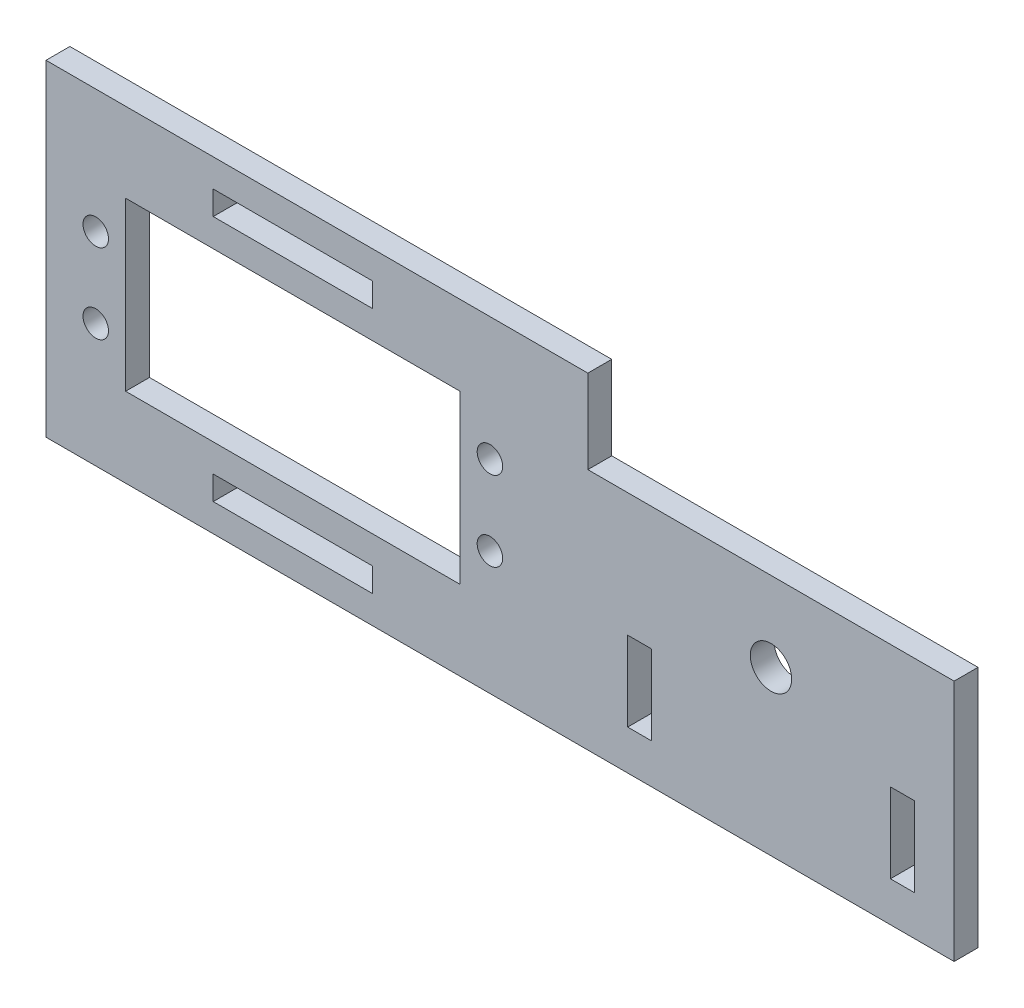
ISO-10303-21;
HEADER;
FILE_DESCRIPTION(('STEP AP214'),'2;1');
FILE_NAME('part.step','',(''),(''),'','','');
FILE_SCHEMA(('AUTOMOTIVE_DESIGN { 1 0 10303 214 1 1 1 1 }'));
ENDSEC;
DATA;
#1=APPLICATION_CONTEXT('core data for automotive mechanical design processes');
#2=APPLICATION_PROTOCOL_DEFINITION('international standard','automotive_design',2000,#1);
#3=PRODUCT_CONTEXT('',#1,'mechanical');
#4=PRODUCT('Part','Part','',(#3));
#5=PRODUCT_RELATED_PRODUCT_CATEGORY('part','',(#4));
#6=PRODUCT_DEFINITION_FORMATION('','',#4);
#7=PRODUCT_DEFINITION_CONTEXT('part definition',#1,'design');
#8=PRODUCT_DEFINITION('design','',#6,#7);
#9=PRODUCT_DEFINITION_SHAPE('','',#8);
#10=(LENGTH_UNIT() NAMED_UNIT(*) SI_UNIT(.MILLI.,.METRE.));
#11=(NAMED_UNIT(*) PLANE_ANGLE_UNIT() SI_UNIT($,.RADIAN.));
#12=(NAMED_UNIT(*) SI_UNIT($,.STERADIAN.) SOLID_ANGLE_UNIT());
#13=UNCERTAINTY_MEASURE_WITH_UNIT(LENGTH_MEASURE(1.E-05),#10,'distance_accuracy_value','');
#14=(GEOMETRIC_REPRESENTATION_CONTEXT(3) GLOBAL_UNCERTAINTY_ASSIGNED_CONTEXT((#13)) GLOBAL_UNIT_ASSIGNED_CONTEXT((#10,
#11,#12)) REPRESENTATION_CONTEXT('',''));
#15=CARTESIAN_POINT('',(0.,0.,0.));
#16=DIRECTION('',(0.,0.,1.));
#17=DIRECTION('',(1.,0.,0.));
#18=AXIS2_PLACEMENT_3D('',#15,#16,#17);
#19=CARTESIAN_POINT('',(0.,5.,3.));
#20=DIRECTION('',(0.,1.,0.));
#21=DIRECTION('',(-1.,0.,0.));
#22=AXIS2_PLACEMENT_3D('',#19,#20,#21);
#23=PLANE('',#22);
#24=DIRECTION('',(1.,0.,0.));
#25=VECTOR('',#24,1.);
#26=CARTESIAN_POINT('',(0.,5.,0.));
#27=LINE('',#26,#25);
#28=CARTESIAN_POINT('',(15.,5.,0.));
#29=VERTEX_POINT('',#28);
#30=CARTESIAN_POINT('',(18.,5.00000000000001,0.));
#31=VERTEX_POINT('',#30);
#32=EDGE_CURVE('E372',#29,#31,#27,.T.);
#33=ORIENTED_EDGE('',*,*,#32,.F.);
#34=DIRECTION('',(0.,0.,-1.));
#35=VECTOR('',#34,1.);
#36=CARTESIAN_POINT('',(15.,5.,3.));
#37=LINE('',#36,#35);
#38=CARTESIAN_POINT('',(15.,5.,3.));
#39=VERTEX_POINT('',#38);
#40=EDGE_CURVE('E11',#39,#29,#37,.T.);
#41=ORIENTED_EDGE('',*,*,#40,.F.);
#42=DIRECTION('',(1.,0.,0.));
#43=VECTOR('',#42,1.);
#44=CARTESIAN_POINT('',(0.,5.,3.));
#45=LINE('',#44,#43);
#46=CARTESIAN_POINT('',(18.,5.00000000000001,3.));
#47=VERTEX_POINT('',#46);
#48=EDGE_CURVE('E231',#39,#47,#45,.T.);
#49=ORIENTED_EDGE('',*,*,#48,.T.);
#50=DIRECTION('',(0.,0.,-1.));
#51=VECTOR('',#50,1.);
#52=CARTESIAN_POINT('',(18.,5.00000000000001,3.));
#53=LINE('',#52,#51);
#54=EDGE_CURVE('E56',#47,#31,#53,.T.);
#55=ORIENTED_EDGE('',*,*,#54,.T.);
#56=EDGE_LOOP('',(#33,#41,#49,#55));
#57=FACE_BOUND('',#56,.T.);
#58=ADVANCED_FACE('F37',(#57),#23,.T.);
#59=CARTESIAN_POINT('',(15.,0.,3.));
#60=DIRECTION('',(-1.,0.,0.));
#61=DIRECTION('',(0.,-1.,0.));
#62=AXIS2_PLACEMENT_3D('',#59,#60,#61);
#63=PLANE('',#62);
#64=DIRECTION('',(0.,1.,0.));
#65=VECTOR('',#64,1.);
#66=CARTESIAN_POINT('',(15.,0.,0.));
#67=LINE('',#66,#65);
#68=CARTESIAN_POINT('',(15.,15.,0.));
#69=VERTEX_POINT('',#68);
#70=EDGE_CURVE('E236',#29,#69,#67,.T.);
#71=ORIENTED_EDGE('',*,*,#70,.T.);
#72=DIRECTION('',(0.,0.,-1.));
#73=VECTOR('',#72,1.);
#74=CARTESIAN_POINT('',(15.,15.,3.));
#75=LINE('',#74,#73);
#76=CARTESIAN_POINT('',(15.,15.,3.));
#77=VERTEX_POINT('',#76);
#78=EDGE_CURVE('E47',#77,#69,#75,.T.);
#79=ORIENTED_EDGE('',*,*,#78,.F.);
#80=DIRECTION('',(0.,1.,0.));
#81=VECTOR('',#80,1.);
#82=CARTESIAN_POINT('',(15.,0.,3.));
#83=LINE('',#82,#81);
#84=EDGE_CURVE('E225',#39,#77,#83,.T.);
#85=ORIENTED_EDGE('',*,*,#84,.F.);
#86=ORIENTED_EDGE('',*,*,#40,.T.);
#87=EDGE_LOOP('',(#71,#79,#85,#86));
#88=FACE_BOUND('',#87,.T.);
#89=ADVANCED_FACE('F234',(#88),#63,.F.);
#90=CARTESIAN_POINT('',(0.,15.,3.));
#91=DIRECTION('',(0.,1.,0.));
#92=DIRECTION('',(-1.,0.,0.));
#93=AXIS2_PLACEMENT_3D('',#90,#91,#92);
#94=PLANE('',#93);
#95=DIRECTION('',(1.,0.,0.));
#96=VECTOR('',#95,1.);
#97=CARTESIAN_POINT('',(0.,15.,0.));
#98=LINE('',#97,#96);
#99=CARTESIAN_POINT('',(18.,15.,0.));
#100=VERTEX_POINT('',#99);
#101=EDGE_CURVE('E375',#69,#100,#98,.T.);
#102=ORIENTED_EDGE('',*,*,#101,.T.);
#103=DIRECTION('',(0.,0.,-1.));
#104=VECTOR('',#103,1.);
#105=CARTESIAN_POINT('',(18.,15.,3.));
#106=LINE('',#105,#104);
#107=CARTESIAN_POINT('',(18.,15.,3.));
#108=VERTEX_POINT('',#107);
#109=EDGE_CURVE('E136',#108,#100,#106,.T.);
#110=ORIENTED_EDGE('',*,*,#109,.F.);
#111=DIRECTION('',(1.,0.,0.));
#112=VECTOR('',#111,1.);
#113=CARTESIAN_POINT('',(0.,15.,3.));
#114=LINE('',#113,#112);
#115=EDGE_CURVE('E217',#77,#108,#114,.T.);
#116=ORIENTED_EDGE('',*,*,#115,.F.);
#117=ORIENTED_EDGE('',*,*,#78,.T.);
#118=EDGE_LOOP('',(#102,#110,#116,#117));
#119=FACE_BOUND('',#118,.T.);
#120=ADVANCED_FACE('F219',(#119),#94,.F.);
#121=CARTESIAN_POINT('',(0.,5.,3.));
#122=DIRECTION('',(0.,-1.,0.));
#123=DIRECTION('',(0.,0.,-1.));
#124=AXIS2_PLACEMENT_3D('',#121,#122,#123);
#125=PLANE('',#124);
#126=DIRECTION('',(-1.,0.,0.));
#127=VECTOR('',#126,1.);
#128=CARTESIAN_POINT('',(0.,5.,0.));
#129=LINE('',#128,#127);
#130=CARTESIAN_POINT('',(-15.,5.,0.));
#131=VERTEX_POINT('',#130);
#132=CARTESIAN_POINT('',(-18.,5.,0.));
#133=VERTEX_POINT('',#132);
#134=EDGE_CURVE('E360',#131,#133,#129,.T.);
#135=ORIENTED_EDGE('',*,*,#134,.T.);
#136=DIRECTION('',(0.,0.,-1.));
#137=VECTOR('',#136,1.);
#138=CARTESIAN_POINT('',(-18.,5.,3.));
#139=LINE('',#138,#137);
#140=CARTESIAN_POINT('',(-18.,5.,3.));
#141=VERTEX_POINT('',#140);
#142=EDGE_CURVE('E248',#141,#133,#139,.T.);
#143=ORIENTED_EDGE('',*,*,#142,.F.);
#144=DIRECTION('',(-1.,0.,0.));
#145=VECTOR('',#144,1.);
#146=CARTESIAN_POINT('',(0.,5.,3.));
#147=LINE('',#146,#145);
#148=CARTESIAN_POINT('',(-15.,5.,3.));
#149=VERTEX_POINT('',#148);
#150=EDGE_CURVE('E446',#149,#141,#147,.T.);
#151=ORIENTED_EDGE('',*,*,#150,.F.);
#152=DIRECTION('',(0.,0.,-1.));
#153=VECTOR('',#152,1.);
#154=CARTESIAN_POINT('',(-15.,5.,3.));
#155=LINE('',#154,#153);
#156=EDGE_CURVE('E241',#149,#131,#155,.T.);
#157=ORIENTED_EDGE('',*,*,#156,.T.);
#158=EDGE_LOOP('',(#135,#143,#151,#157));
#159=FACE_BOUND('',#158,.T.);
#160=ADVANCED_FACE('F506',(#159),#125,.F.);
#161=CARTESIAN_POINT('',(-18.,0.,3.));
#162=DIRECTION('',(-1.,0.,0.));
#163=DIRECTION('',(0.,-1.,0.));
#164=AXIS2_PLACEMENT_3D('',#161,#162,#163);
#165=PLANE('',#164);
#166=DIRECTION('',(0.,1.,0.));
#167=VECTOR('',#166,1.);
#168=CARTESIAN_POINT('',(-18.,0.,0.));
#169=LINE('',#168,#167);
#170=CARTESIAN_POINT('',(-18.,15.,0.));
#171=VERTEX_POINT('',#170);
#172=EDGE_CURVE('E363',#133,#171,#169,.T.);
#173=ORIENTED_EDGE('',*,*,#172,.T.);
#174=DIRECTION('',(0.,0.,-1.));
#175=VECTOR('',#174,1.);
#176=CARTESIAN_POINT('',(-18.,15.,3.));
#177=LINE('',#176,#175);
#178=CARTESIAN_POINT('',(-18.,15.,3.));
#179=VERTEX_POINT('',#178);
#180=EDGE_CURVE('E246',#179,#171,#177,.T.);
#181=ORIENTED_EDGE('',*,*,#180,.F.);
#182=DIRECTION('',(0.,1.,0.));
#183=VECTOR('',#182,1.);
#184=CARTESIAN_POINT('',(-18.,0.,3.));
#185=LINE('',#184,#183);
#186=EDGE_CURVE('E449',#141,#179,#185,.T.);
#187=ORIENTED_EDGE('',*,*,#186,.F.);
#188=ORIENTED_EDGE('',*,*,#142,.T.);
#189=EDGE_LOOP('',(#173,#181,#187,#188));
#190=FACE_BOUND('',#189,.T.);
#191=ADVANCED_FACE('F502',(#190),#165,.F.);
#192=CARTESIAN_POINT('',(0.,15.,3.));
#193=DIRECTION('',(0.,-1.,0.));
#194=DIRECTION('',(0.,0.,-1.));
#195=AXIS2_PLACEMENT_3D('',#192,#193,#194);
#196=PLANE('',#195);
#197=DIRECTION('',(-1.,0.,0.));
#198=VECTOR('',#197,1.);
#199=CARTESIAN_POINT('',(0.,15.,0.));
#200=LINE('',#199,#198);
#201=CARTESIAN_POINT('',(-15.,15.,0.));
#202=VERTEX_POINT('',#201);
#203=EDGE_CURVE('E366',#202,#171,#200,.T.);
#204=ORIENTED_EDGE('',*,*,#203,.F.);
#205=DIRECTION('',(0.,0.,-1.));
#206=VECTOR('',#205,1.);
#207=CARTESIAN_POINT('',(-15.,15.,3.));
#208=LINE('',#207,#206);
#209=CARTESIAN_POINT('',(-15.,15.,3.));
#210=VERTEX_POINT('',#209);
#211=EDGE_CURVE('E243',#210,#202,#208,.T.);
#212=ORIENTED_EDGE('',*,*,#211,.F.);
#213=DIRECTION('',(-1.,0.,0.));
#214=VECTOR('',#213,1.);
#215=CARTESIAN_POINT('',(0.,15.,3.));
#216=LINE('',#215,#214);
#217=EDGE_CURVE('E451',#210,#179,#216,.T.);
#218=ORIENTED_EDGE('',*,*,#217,.T.);
#219=ORIENTED_EDGE('',*,*,#180,.T.);
#220=EDGE_LOOP('',(#204,#212,#218,#219));
#221=FACE_BOUND('',#220,.T.);
#222=ADVANCED_FACE('F498',(#221),#196,.T.);
#223=CARTESIAN_POINT('',(-23.,0.,3.));
#224=DIRECTION('',(1.,0.,0.));
#225=DIRECTION('',(0.,1.,0.));
#226=AXIS2_PLACEMENT_3D('',#223,#224,#225);
#227=PLANE('',#226);
#228=DIRECTION('',(0.,-1.,0.));
#229=VECTOR('',#228,1.);
#230=CARTESIAN_POINT('',(-23.,0.,0.));
#231=LINE('',#230,#229);
#232=CARTESIAN_POINT('',(-23.,41.,0.));
#233=VERTEX_POINT('',#232);
#234=CARTESIAN_POINT('',(-23.,30.5,0.));
#235=VERTEX_POINT('',#234);
#236=EDGE_CURVE('E342',#233,#235,#231,.T.);
#237=ORIENTED_EDGE('',*,*,#236,.F.);
#238=DIRECTION('',(0.,0.,-1.));
#239=VECTOR('',#238,1.);
#240=CARTESIAN_POINT('',(-23.,41.,3.));
#241=LINE('',#240,#239);
#242=CARTESIAN_POINT('',(-23.,41.,3.));
#243=VERTEX_POINT('',#242);
#244=EDGE_CURVE('E244',#243,#233,#241,.T.);
#245=ORIENTED_EDGE('',*,*,#244,.F.);
#246=DIRECTION('',(0.,-1.,0.));
#247=VECTOR('',#246,1.);
#248=CARTESIAN_POINT('',(-23.,0.,3.));
#249=LINE('',#248,#247);
#250=CARTESIAN_POINT('',(-23.,30.5,3.));
#251=VERTEX_POINT('',#250);
#252=EDGE_CURVE('E429',#243,#251,#249,.T.);
#253=ORIENTED_EDGE('',*,*,#252,.T.);
#254=DIRECTION('',(0.,0.,-1.));
#255=VECTOR('',#254,1.);
#256=CARTESIAN_POINT('',(-23.,30.5,3.));
#257=LINE('',#256,#255);
#258=EDGE_CURVE('E251',#251,#235,#257,.T.);
#259=ORIENTED_EDGE('',*,*,#258,.T.);
#260=EDGE_LOOP('',(#237,#245,#253,#259));
#261=FACE_BOUND('',#260,.T.);
#262=ADVANCED_FACE('F501',(#261),#227,.T.);
#263=CARTESIAN_POINT('',(0.,41.,3.));
#264=DIRECTION('',(0.,1.,0.));
#265=DIRECTION('',(-1.,0.,0.));
#266=AXIS2_PLACEMENT_3D('',#263,#264,#265);
#267=PLANE('',#266);
#268=DIRECTION('',(1.,0.,0.));
#269=VECTOR('',#268,1.);
#270=CARTESIAN_POINT('',(0.,41.,0.));
#271=LINE('',#270,#269);
#272=CARTESIAN_POINT('',(-91.05,41.,0.));
#273=VERTEX_POINT('',#272);
#274=EDGE_CURVE('E345',#273,#233,#271,.T.);
#275=ORIENTED_EDGE('',*,*,#274,.F.);
#276=DIRECTION('',(0.,0.,-1.));
#277=VECTOR('',#276,1.);
#278=CARTESIAN_POINT('',(-91.05,41.,3.));
#279=LINE('',#278,#277);
#280=CARTESIAN_POINT('',(-91.05,41.,3.));
#281=VERTEX_POINT('',#280);
#282=EDGE_CURVE('E261',#281,#273,#279,.T.);
#283=ORIENTED_EDGE('',*,*,#282,.F.);
#284=DIRECTION('',(1.,0.,0.));
#285=VECTOR('',#284,1.);
#286=CARTESIAN_POINT('',(0.,41.,3.));
#287=LINE('',#286,#285);
#288=EDGE_CURVE('E432',#281,#243,#287,.T.);
#289=ORIENTED_EDGE('',*,*,#288,.T.);
#290=ORIENTED_EDGE('',*,*,#244,.T.);
#291=EDGE_LOOP('',(#275,#283,#289,#290));
#292=FACE_BOUND('',#291,.T.);
#293=ADVANCED_FACE('F527',(#292),#267,.T.);
#294=CARTESIAN_POINT('',(-91.05,0.,3.));
#295=DIRECTION('',(-1.,0.,0.));
#296=DIRECTION('',(0.,-1.,0.));
#297=AXIS2_PLACEMENT_3D('',#294,#295,#296);
#298=PLANE('',#297);
#299=DIRECTION('',(0.,1.,0.));
#300=VECTOR('',#299,1.);
#301=CARTESIAN_POINT('',(-91.05,0.,0.));
#302=LINE('',#301,#300);
#303=CARTESIAN_POINT('',(-91.05,0.,0.));
#304=VERTEX_POINT('',#303);
#305=EDGE_CURVE('E348',#304,#273,#302,.T.);
#306=ORIENTED_EDGE('',*,*,#305,.F.);
#307=DIRECTION('',(0.,0.,-1.));
#308=VECTOR('',#307,1.);
#309=CARTESIAN_POINT('',(-91.05,0.,3.));
#310=LINE('',#309,#308);
#311=CARTESIAN_POINT('',(-91.05,0.,3.));
#312=VERTEX_POINT('',#311);
#313=EDGE_CURVE('E259',#312,#304,#310,.T.);
#314=ORIENTED_EDGE('',*,*,#313,.F.);
#315=DIRECTION('',(0.,1.,0.));
#316=VECTOR('',#315,1.);
#317=CARTESIAN_POINT('',(-91.05,0.,3.));
#318=LINE('',#317,#316);
#319=EDGE_CURVE('E435',#312,#281,#318,.T.);
#320=ORIENTED_EDGE('',*,*,#319,.T.);
#321=ORIENTED_EDGE('',*,*,#282,.T.);
#322=EDGE_LOOP('',(#306,#314,#320,#321));
#323=FACE_BOUND('',#322,.T.);
#324=ADVANCED_FACE('F523',(#323),#298,.T.);
#325=CARTESIAN_POINT('',(0.,0.,3.));
#326=DIRECTION('',(0.,-1.,0.));
#327=DIRECTION('',(1.,0.,0.));
#328=AXIS2_PLACEMENT_3D('',#325,#326,#327);
#329=PLANE('',#328);
#330=DIRECTION('',(-1.,0.,0.));
#331=VECTOR('',#330,1.);
#332=CARTESIAN_POINT('',(0.,0.,0.));
#333=LINE('',#332,#331);
#334=CARTESIAN_POINT('',(23.,0.,0.));
#335=VERTEX_POINT('',#334);
#336=EDGE_CURVE('E351',#335,#304,#333,.T.);
#337=ORIENTED_EDGE('',*,*,#336,.F.);
#338=DIRECTION('',(0.,0.,-1.));
#339=VECTOR('',#338,1.);
#340=CARTESIAN_POINT('',(23.,0.,3.));
#341=LINE('',#340,#339);
#342=CARTESIAN_POINT('',(23.,0.,3.));
#343=VERTEX_POINT('',#342);
#344=EDGE_CURVE('E257',#343,#335,#341,.T.);
#345=ORIENTED_EDGE('',*,*,#344,.F.);
#346=DIRECTION('',(-1.,0.,0.));
#347=VECTOR('',#346,1.);
#348=CARTESIAN_POINT('',(0.,0.,3.));
#349=LINE('',#348,#347);
#350=EDGE_CURVE('E438',#343,#312,#349,.T.);
#351=ORIENTED_EDGE('',*,*,#350,.T.);
#352=ORIENTED_EDGE('',*,*,#313,.T.);
#353=EDGE_LOOP('',(#337,#345,#351,#352));
#354=FACE_BOUND('',#353,.T.);
#355=ADVANCED_FACE('F519',(#354),#329,.T.);
#356=CARTESIAN_POINT('',(23.,0.,3.));
#357=DIRECTION('',(-1.,0.,0.));
#358=DIRECTION('',(0.,-1.,0.));
#359=AXIS2_PLACEMENT_3D('',#356,#357,#358);
#360=PLANE('',#359);
#361=DIRECTION('',(0.,1.,0.));
#362=VECTOR('',#361,1.);
#363=CARTESIAN_POINT('',(23.,0.,0.));
#364=LINE('',#363,#362);
#365=CARTESIAN_POINT('',(23.,30.5,0.));
#366=VERTEX_POINT('',#365);
#367=EDGE_CURVE('E354',#335,#366,#364,.T.);
#368=ORIENTED_EDGE('',*,*,#367,.T.);
#369=DIRECTION('',(0.,0.,-1.));
#370=VECTOR('',#369,1.);
#371=CARTESIAN_POINT('',(23.,30.5,3.));
#372=LINE('',#371,#370);
#373=CARTESIAN_POINT('',(23.,30.5,3.));
#374=VERTEX_POINT('',#373);
#375=EDGE_CURVE('E253',#374,#366,#372,.T.);
#376=ORIENTED_EDGE('',*,*,#375,.F.);
#377=DIRECTION('',(0.,1.,0.));
#378=VECTOR('',#377,1.);
#379=CARTESIAN_POINT('',(23.,0.,3.));
#380=LINE('',#379,#378);
#381=EDGE_CURVE('E441',#343,#374,#380,.T.);
#382=ORIENTED_EDGE('',*,*,#381,.F.);
#383=ORIENTED_EDGE('',*,*,#344,.T.);
#384=EDGE_LOOP('',(#368,#376,#382,#383));
#385=FACE_BOUND('',#384,.T.);
#386=ADVANCED_FACE('F515',(#385),#360,.F.);
#387=CARTESIAN_POINT('',(-39.05,0.,3.));
#388=DIRECTION('',(-1.,0.,0.));
#389=DIRECTION('',(0.,-1.,0.));
#390=AXIS2_PLACEMENT_3D('',#387,#388,#389);
#391=PLANE('',#390);
#392=DIRECTION('',(0.,1.,0.));
#393=VECTOR('',#392,1.);
#394=CARTESIAN_POINT('',(-39.05,0.,0.));
#395=LINE('',#394,#393);
#396=CARTESIAN_POINT('',(-39.05,10.,0.));
#397=VERTEX_POINT('',#396);
#398=CARTESIAN_POINT('',(-39.05,31.,0.));
#399=VERTEX_POINT('',#398);
#400=EDGE_CURVE('E330',#397,#399,#395,.T.);
#401=ORIENTED_EDGE('',*,*,#400,.F.);
#402=DIRECTION('',(0.,0.,-1.));
#403=VECTOR('',#402,1.);
#404=CARTESIAN_POINT('',(-39.05,10.,3.));
#405=LINE('',#404,#403);
#406=CARTESIAN_POINT('',(-39.05,10.,3.));
#407=VERTEX_POINT('',#406);
#408=EDGE_CURVE('E254',#407,#397,#405,.T.);
#409=ORIENTED_EDGE('',*,*,#408,.F.);
#410=DIRECTION('',(0.,1.,0.));
#411=VECTOR('',#410,1.);
#412=CARTESIAN_POINT('',(-39.05,0.,3.));
#413=LINE('',#412,#411);
#414=CARTESIAN_POINT('',(-39.05,31.,3.));
#415=VERTEX_POINT('',#414);
#416=EDGE_CURVE('E418',#407,#415,#413,.T.);
#417=ORIENTED_EDGE('',*,*,#416,.T.);
#418=DIRECTION('',(0.,0.,-1.));
#419=VECTOR('',#418,1.);
#420=CARTESIAN_POINT('',(-39.05,31.,3.));
#421=LINE('',#420,#419);
#422=EDGE_CURVE('E264',#415,#399,#421,.T.);
#423=ORIENTED_EDGE('',*,*,#422,.T.);
#424=EDGE_LOOP('',(#401,#409,#417,#423));
#425=FACE_BOUND('',#424,.T.);
#426=ADVANCED_FACE('F518',(#425),#391,.T.);
#427=CARTESIAN_POINT('',(0.,10.,3.));
#428=DIRECTION('',(0.,1.,0.));
#429=DIRECTION('',(0.,0.,1.));
#430=AXIS2_PLACEMENT_3D('',#427,#428,#429);
#431=PLANE('',#430);
#432=DIRECTION('',(1.,0.,0.));
#433=VECTOR('',#432,1.);
#434=CARTESIAN_POINT('',(0.,10.,0.));
#435=LINE('',#434,#433);
#436=CARTESIAN_POINT('',(-81.05,10.,0.));
#437=VERTEX_POINT('',#436);
#438=EDGE_CURVE('E333',#437,#397,#435,.T.);
#439=ORIENTED_EDGE('',*,*,#438,.F.);
#440=DIRECTION('',(0.,0.,-1.));
#441=VECTOR('',#440,1.);
#442=CARTESIAN_POINT('',(-81.05,10.,3.));
#443=LINE('',#442,#441);
#444=CARTESIAN_POINT('',(-81.05,10.,3.));
#445=VERTEX_POINT('',#444);
#446=EDGE_CURVE('E270',#445,#437,#443,.T.);
#447=ORIENTED_EDGE('',*,*,#446,.F.);
#448=DIRECTION('',(1.,0.,0.));
#449=VECTOR('',#448,1.);
#450=CARTESIAN_POINT('',(0.,10.,3.));
#451=LINE('',#450,#449);
#452=EDGE_CURVE('E421',#445,#407,#451,.T.);
#453=ORIENTED_EDGE('',*,*,#452,.T.);
#454=ORIENTED_EDGE('',*,*,#408,.T.);
#455=EDGE_LOOP('',(#439,#447,#453,#454));
#456=FACE_BOUND('',#455,.T.);
#457=ADVANCED_FACE('F543',(#456),#431,.T.);
#458=CARTESIAN_POINT('',(-81.05,0.,3.));
#459=DIRECTION('',(-1.,0.,0.));
#460=DIRECTION('',(0.,0.,1.));
#461=AXIS2_PLACEMENT_3D('',#458,#459,#460);
#462=PLANE('',#461);
#463=DIRECTION('',(0.,1.,0.));
#464=VECTOR('',#463,1.);
#465=CARTESIAN_POINT('',(-81.05,0.,0.));
#466=LINE('',#465,#464);
#467=CARTESIAN_POINT('',(-81.05,31.,0.));
#468=VERTEX_POINT('',#467);
#469=EDGE_CURVE('E336',#437,#468,#466,.T.);
#470=ORIENTED_EDGE('',*,*,#469,.T.);
#471=DIRECTION('',(0.,0.,-1.));
#472=VECTOR('',#471,1.);
#473=CARTESIAN_POINT('',(-81.05,31.,3.));
#474=LINE('',#473,#472);
#475=CARTESIAN_POINT('',(-81.05,31.,3.));
#476=VERTEX_POINT('',#475);
#477=EDGE_CURVE('E266',#476,#468,#474,.T.);
#478=ORIENTED_EDGE('',*,*,#477,.F.);
#479=DIRECTION('',(0.,1.,0.));
#480=VECTOR('',#479,1.);
#481=CARTESIAN_POINT('',(-81.05,0.,3.));
#482=LINE('',#481,#480);
#483=EDGE_CURVE('E424',#445,#476,#482,.T.);
#484=ORIENTED_EDGE('',*,*,#483,.F.);
#485=ORIENTED_EDGE('',*,*,#446,.T.);
#486=EDGE_LOOP('',(#470,#478,#484,#485));
#487=FACE_BOUND('',#486,.T.);
#488=ADVANCED_FACE('F539',(#487),#462,.F.);
#489=CARTESIAN_POINT('',(-70.05,0.,3.));
#490=DIRECTION('',(1.,0.,0.));
#491=DIRECTION('',(0.,0.,-1.));
#492=AXIS2_PLACEMENT_3D('',#489,#490,#491);
#493=PLANE('',#492);
#494=DIRECTION('',(0.,-1.,0.));
#495=VECTOR('',#494,1.);
#496=CARTESIAN_POINT('',(-70.05,0.,0.));
#497=LINE('',#496,#495);
#498=CARTESIAN_POINT('',(-70.05,37.5,0.));
#499=VERTEX_POINT('',#498);
#500=CARTESIAN_POINT('',(-70.05,34.5,0.));
#501=VERTEX_POINT('',#500);
#502=EDGE_CURVE('E318',#499,#501,#497,.T.);
#503=ORIENTED_EDGE('',*,*,#502,.F.);
#504=DIRECTION('',(0.,0.,-1.));
#505=VECTOR('',#504,1.);
#506=CARTESIAN_POINT('',(-70.05,37.5,3.));
#507=LINE('',#506,#505);
#508=CARTESIAN_POINT('',(-70.05,37.5,3.));
#509=VERTEX_POINT('',#508);
#510=EDGE_CURVE('E267',#509,#499,#507,.T.);
#511=ORIENTED_EDGE('',*,*,#510,.F.);
#512=DIRECTION('',(0.,-1.,0.));
#513=VECTOR('',#512,1.);
#514=CARTESIAN_POINT('',(-70.05,0.,3.));
#515=LINE('',#514,#513);
#516=CARTESIAN_POINT('',(-70.05,34.5,3.));
#517=VERTEX_POINT('',#516);
#518=EDGE_CURVE('E407',#509,#517,#515,.T.);
#519=ORIENTED_EDGE('',*,*,#518,.T.);
#520=DIRECTION('',(0.,0.,-1.));
#521=VECTOR('',#520,1.);
#522=CARTESIAN_POINT('',(-70.05,34.5,3.));
#523=LINE('',#522,#521);
#524=EDGE_CURVE('E273',#517,#501,#523,.T.);
#525=ORIENTED_EDGE('',*,*,#524,.T.);
#526=EDGE_LOOP('',(#503,#511,#519,#525));
#527=FACE_BOUND('',#526,.T.);
#528=ADVANCED_FACE('F542',(#527),#493,.T.);
#529=CARTESIAN_POINT('',(0.,37.5,3.));
#530=DIRECTION('',(0.,-1.,0.));
#531=DIRECTION('',(0.,0.,-1.));
#532=AXIS2_PLACEMENT_3D('',#529,#530,#531);
#533=PLANE('',#532);
#534=DIRECTION('',(-1.,0.,0.));
#535=VECTOR('',#534,1.);
#536=CARTESIAN_POINT('',(0.,37.5,0.));
#537=LINE('',#536,#535);
#538=CARTESIAN_POINT('',(-50.05,37.5,0.));
#539=VERTEX_POINT('',#538);
#540=EDGE_CURVE('E321',#539,#499,#537,.T.);
#541=ORIENTED_EDGE('',*,*,#540,.F.);
#542=DIRECTION('',(0.,0.,-1.));
#543=VECTOR('',#542,1.);
#544=CARTESIAN_POINT('',(-50.05,37.5,3.));
#545=LINE('',#544,#543);
#546=CARTESIAN_POINT('',(-50.05,37.5,3.));
#547=VERTEX_POINT('',#546);
#548=EDGE_CURVE('E278',#547,#539,#545,.T.);
#549=ORIENTED_EDGE('',*,*,#548,.F.);
#550=DIRECTION('',(-1.,0.,0.));
#551=VECTOR('',#550,1.);
#552=CARTESIAN_POINT('',(0.,37.5,3.));
#553=LINE('',#552,#551);
#554=EDGE_CURVE('E410',#547,#509,#553,.T.);
#555=ORIENTED_EDGE('',*,*,#554,.T.);
#556=ORIENTED_EDGE('',*,*,#510,.T.);
#557=EDGE_LOOP('',(#541,#549,#555,#556));
#558=FACE_BOUND('',#557,.T.);
#559=ADVANCED_FACE('F557',(#558),#533,.T.);
#560=CARTESIAN_POINT('',(-50.05,0.,3.));
#561=DIRECTION('',(1.,0.,0.));
#562=DIRECTION('',(0.,0.,-1.));
#563=AXIS2_PLACEMENT_3D('',#560,#561,#562);
#564=PLANE('',#563);
#565=DIRECTION('',(0.,-1.,0.));
#566=VECTOR('',#565,1.);
#567=CARTESIAN_POINT('',(-50.05,0.,0.));
#568=LINE('',#567,#566);
#569=CARTESIAN_POINT('',(-50.05,34.5,0.));
#570=VERTEX_POINT('',#569);
#571=EDGE_CURVE('E324',#539,#570,#568,.T.);
#572=ORIENTED_EDGE('',*,*,#571,.T.);
#573=DIRECTION('',(0.,0.,-1.));
#574=VECTOR('',#573,1.);
#575=CARTESIAN_POINT('',(-50.05,34.5,3.));
#576=LINE('',#575,#574);
#577=CARTESIAN_POINT('',(-50.05,34.5,3.));
#578=VERTEX_POINT('',#577);
#579=EDGE_CURVE('E275',#578,#570,#576,.T.);
#580=ORIENTED_EDGE('',*,*,#579,.F.);
#581=DIRECTION('',(0.,-1.,0.));
#582=VECTOR('',#581,1.);
#583=CARTESIAN_POINT('',(-50.05,0.,3.));
#584=LINE('',#583,#582);
#585=EDGE_CURVE('E413',#547,#578,#584,.T.);
#586=ORIENTED_EDGE('',*,*,#585,.F.);
#587=ORIENTED_EDGE('',*,*,#548,.T.);
#588=EDGE_LOOP('',(#572,#580,#586,#587));
#589=FACE_BOUND('',#588,.T.);
#590=ADVANCED_FACE('F554',(#589),#564,.F.);
#591=CARTESIAN_POINT('',(-50.05,0.,3.));
#592=DIRECTION('',(-1.,0.,0.));
#593=DIRECTION('',(0.,0.,1.));
#594=AXIS2_PLACEMENT_3D('',#591,#592,#593);
#595=PLANE('',#594);
#596=DIRECTION('',(0.,1.,0.));
#597=VECTOR('',#596,1.);
#598=CARTESIAN_POINT('',(-50.05,0.,0.));
#599=LINE('',#598,#597);
#600=CARTESIAN_POINT('',(-50.05,3.50000000000002,0.));
#601=VERTEX_POINT('',#600);
#602=CARTESIAN_POINT('',(-50.05,6.50000000000002,0.));
#603=VERTEX_POINT('',#602);
#604=EDGE_CURVE('E303',#601,#603,#599,.T.);
#605=ORIENTED_EDGE('',*,*,#604,.F.);
#606=DIRECTION('',(0.,0.,-1.));
#607=VECTOR('',#606,1.);
#608=CARTESIAN_POINT('',(-50.05,3.50000000000002,3.));
#609=LINE('',#608,#607);
#610=CARTESIAN_POINT('',(-50.05,3.50000000000002,3.));
#611=VERTEX_POINT('',#610);
#612=EDGE_CURVE('E41',#611,#601,#609,.T.);
#613=ORIENTED_EDGE('',*,*,#612,.F.);
#614=DIRECTION('',(0.,1.,0.));
#615=VECTOR('',#614,1.);
#616=CARTESIAN_POINT('',(-50.05,0.,3.));
#617=LINE('',#616,#615);
#618=CARTESIAN_POINT('',(-50.05,6.50000000000002,3.));
#619=VERTEX_POINT('',#618);
#620=EDGE_CURVE('E399',#611,#619,#617,.T.);
#621=ORIENTED_EDGE('',*,*,#620,.T.);
#622=DIRECTION('',(0.,0.,-1.));
#623=VECTOR('',#622,1.);
#624=CARTESIAN_POINT('',(-50.05,6.50000000000002,3.));
#625=LINE('',#624,#623);
#626=EDGE_CURVE('E281',#619,#603,#625,.T.);
#627=ORIENTED_EDGE('',*,*,#626,.T.);
#628=EDGE_LOOP('',(#605,#613,#621,#627));
#629=FACE_BOUND('',#628,.T.);
#630=ADVANCED_FACE('F307',(#629),#595,.T.);
#631=CARTESIAN_POINT('',(0.,3.50000000000005,3.));
#632=DIRECTION('',(0.,-1.,0.));
#633=DIRECTION('',(1.,0.,0.));
#634=AXIS2_PLACEMENT_3D('',#631,#632,#633);
#635=PLANE('',#634);
#636=DIRECTION('',(-1.,0.,0.));
#637=VECTOR('',#636,1.);
#638=CARTESIAN_POINT('',(0.,3.50000000000005,0.));
#639=LINE('',#638,#637);
#640=CARTESIAN_POINT('',(-70.05,3.5,0.));
#641=VERTEX_POINT('',#640);
#642=EDGE_CURVE('E294',#601,#641,#639,.T.);
#643=ORIENTED_EDGE('',*,*,#642,.T.);
#644=DIRECTION('',(0.,0.,-1.));
#645=VECTOR('',#644,1.);
#646=CARTESIAN_POINT('',(-70.05,3.5,3.));
#647=LINE('',#646,#645);
#648=CARTESIAN_POINT('',(-70.05,3.5,3.));
#649=VERTEX_POINT('',#648);
#650=EDGE_CURVE('E285',#649,#641,#647,.T.);
#651=ORIENTED_EDGE('',*,*,#650,.F.);
#652=DIRECTION('',(-1.,0.,0.));
#653=VECTOR('',#652,1.);
#654=CARTESIAN_POINT('',(0.,3.50000000000005,3.));
#655=LINE('',#654,#653);
#656=EDGE_CURVE('E296',#611,#649,#655,.T.);
#657=ORIENTED_EDGE('',*,*,#656,.F.);
#658=ORIENTED_EDGE('',*,*,#612,.T.);
#659=EDGE_LOOP('',(#643,#651,#657,#658));
#660=FACE_BOUND('',#659,.T.);
#661=ADVANCED_FACE('F293',(#660),#635,.F.);
#662=CARTESIAN_POINT('',(-70.05,0.,3.));
#663=DIRECTION('',(-1.,0.,0.));
#664=DIRECTION('',(0.,0.,1.));
#665=AXIS2_PLACEMENT_3D('',#662,#663,#664);
#666=PLANE('',#665);
#667=DIRECTION('',(0.,1.,0.));
#668=VECTOR('',#667,1.);
#669=CARTESIAN_POINT('',(-70.05,0.,0.));
#670=LINE('',#669,#668);
#671=CARTESIAN_POINT('',(-70.05,6.50000000000001,0.));
#672=VERTEX_POINT('',#671);
#673=EDGE_CURVE('E305',#641,#672,#670,.T.);
#674=ORIENTED_EDGE('',*,*,#673,.T.);
#675=DIRECTION('',(0.,0.,-1.));
#676=VECTOR('',#675,1.);
#677=CARTESIAN_POINT('',(-70.05,6.50000000000001,3.));
#678=LINE('',#677,#676);
#679=CARTESIAN_POINT('',(-70.05,6.50000000000001,3.));
#680=VERTEX_POINT('',#679);
#681=EDGE_CURVE('E283',#680,#672,#678,.T.);
#682=ORIENTED_EDGE('',*,*,#681,.F.);
#683=DIRECTION('',(0.,1.,0.));
#684=VECTOR('',#683,1.);
#685=CARTESIAN_POINT('',(-70.05,0.,3.));
#686=LINE('',#685,#684);
#687=EDGE_CURVE('E402',#649,#680,#686,.T.);
#688=ORIENTED_EDGE('',*,*,#687,.F.);
#689=ORIENTED_EDGE('',*,*,#650,.T.);
#690=EDGE_LOOP('',(#674,#682,#688,#689));
#691=FACE_BOUND('',#690,.T.);
#692=ADVANCED_FACE('F568',(#691),#666,.F.);
#693=CARTESIAN_POINT('',(-35.3,25.5,3.));
#694=DIRECTION('',(0.,0.,-1.));
#695=DIRECTION('',(-1.,0.,0.));
#696=AXIS2_PLACEMENT_3D('',#693,#694,#695);
#697=CYLINDRICAL_SURFACE('',#696,1.6);
#698=CARTESIAN_POINT('',(-35.3,25.5,3.));
#699=DIRECTION('',(0.,0.,1.));
#700=DIRECTION('',(1.,0.,0.));
#701=AXIS2_PLACEMENT_3D('',#698,#699,#700);
#702=CIRCLE('',#701,1.6);
#703=CARTESIAN_POINT('',(-33.7,25.5,3.));
#704=VERTEX_POINT('',#703);
#705=EDGE_CURVE('E459',#704,#704,#702,.T.);
#706=ORIENTED_EDGE('',*,*,#705,.T.);
#707=EDGE_LOOP('',(#706));
#708=FACE_BOUND('',#707,.T.);
#709=CARTESIAN_POINT('',(-35.3,25.5,0.));
#710=DIRECTION('',(0.,0.,1.));
#711=DIRECTION('',(1.,0.,0.));
#712=AXIS2_PLACEMENT_3D('',#709,#710,#711);
#713=CIRCLE('',#712,1.6);
#714=CARTESIAN_POINT('',(-33.7,25.5,0.));
#715=VERTEX_POINT('',#714);
#716=EDGE_CURVE('E380',#715,#715,#713,.T.);
#717=ORIENTED_EDGE('',*,*,#716,.F.);
#718=EDGE_LOOP('',(#717));
#719=FACE_BOUND('',#718,.T.);
#720=ADVANCED_FACE('F571',(#708,#719),#697,.F.);
#721=CARTESIAN_POINT('',(18.,0.,3.));
#722=DIRECTION('',(-1.,0.,0.));
#723=DIRECTION('',(0.,-1.,0.));
#724=AXIS2_PLACEMENT_3D('',#721,#722,#723);
#725=PLANE('',#724);
#726=DIRECTION('',(0.,1.,0.));
#727=VECTOR('',#726,1.);
#728=CARTESIAN_POINT('',(18.,0.,0.));
#729=LINE('',#728,#727);
#730=EDGE_CURVE('E377',#31,#100,#729,.T.);
#731=ORIENTED_EDGE('',*,*,#730,.F.);
#732=ORIENTED_EDGE('',*,*,#54,.F.);
#733=DIRECTION('',(0.,1.,0.));
#734=VECTOR('',#733,1.);
#735=CARTESIAN_POINT('',(18.,0.,3.));
#736=LINE('',#735,#734);
#737=EDGE_CURVE('E224',#47,#108,#736,.T.);
#738=ORIENTED_EDGE('',*,*,#737,.T.);
#739=ORIENTED_EDGE('',*,*,#109,.T.);
#740=EDGE_LOOP('',(#731,#732,#738,#739));
#741=FACE_BOUND('',#740,.T.);
#742=ADVANCED_FACE('F496',(#741),#725,.T.);
#743=CARTESIAN_POINT('',(-15.,0.,3.));
#744=DIRECTION('',(-1.,0.,0.));
#745=DIRECTION('',(0.,-1.,0.));
#746=AXIS2_PLACEMENT_3D('',#743,#744,#745);
#747=PLANE('',#746);
#748=DIRECTION('',(0.,1.,0.));
#749=VECTOR('',#748,1.);
#750=CARTESIAN_POINT('',(-15.,0.,0.));
#751=LINE('',#750,#749);
#752=EDGE_CURVE('E369',#131,#202,#751,.T.);
#753=ORIENTED_EDGE('',*,*,#752,.F.);
#754=ORIENTED_EDGE('',*,*,#156,.F.);
#755=DIRECTION('',(0.,1.,0.));
#756=VECTOR('',#755,1.);
#757=CARTESIAN_POINT('',(-15.,0.,3.));
#758=LINE('',#757,#756);
#759=EDGE_CURVE('E454',#149,#210,#758,.T.);
#760=ORIENTED_EDGE('',*,*,#759,.T.);
#761=ORIENTED_EDGE('',*,*,#211,.T.);
#762=EDGE_LOOP('',(#753,#754,#760,#761));
#763=FACE_BOUND('',#762,.T.);
#764=ADVANCED_FACE('F492',(#763),#747,.T.);
#765=CARTESIAN_POINT('',(0.,30.5,3.));
#766=DIRECTION('',(0.,-1.,0.));
#767=DIRECTION('',(0.,0.,-1.));
#768=AXIS2_PLACEMENT_3D('',#765,#766,#767);
#769=PLANE('',#768);
#770=DIRECTION('',(-1.,0.,0.));
#771=VECTOR('',#770,1.);
#772=CARTESIAN_POINT('',(0.,30.5,0.));
#773=LINE('',#772,#771);
#774=EDGE_CURVE('E357',#366,#235,#773,.T.);
#775=ORIENTED_EDGE('',*,*,#774,.T.);
#776=ORIENTED_EDGE('',*,*,#258,.F.);
#777=DIRECTION('',(-1.,0.,0.));
#778=VECTOR('',#777,1.);
#779=CARTESIAN_POINT('',(0.,30.5,3.));
#780=LINE('',#779,#778);
#781=EDGE_CURVE('E444',#374,#251,#780,.T.);
#782=ORIENTED_EDGE('',*,*,#781,.F.);
#783=ORIENTED_EDGE('',*,*,#375,.T.);
#784=EDGE_LOOP('',(#775,#776,#782,#783));
#785=FACE_BOUND('',#784,.T.);
#786=ADVANCED_FACE('F495',(#785),#769,.F.);
#787=CARTESIAN_POINT('',(0.,31.,3.));
#788=DIRECTION('',(0.,1.,0.));
#789=DIRECTION('',(0.,0.,1.));
#790=AXIS2_PLACEMENT_3D('',#787,#788,#789);
#791=PLANE('',#790);
#792=DIRECTION('',(1.,0.,0.));
#793=VECTOR('',#792,1.);
#794=CARTESIAN_POINT('',(0.,31.,0.));
#795=LINE('',#794,#793);
#796=EDGE_CURVE('E339',#468,#399,#795,.T.);
#797=ORIENTED_EDGE('',*,*,#796,.T.);
#798=ORIENTED_EDGE('',*,*,#422,.F.);
#799=DIRECTION('',(1.,0.,0.));
#800=VECTOR('',#799,1.);
#801=CARTESIAN_POINT('',(0.,31.,3.));
#802=LINE('',#801,#800);
#803=EDGE_CURVE('E427',#476,#415,#802,.T.);
#804=ORIENTED_EDGE('',*,*,#803,.F.);
#805=ORIENTED_EDGE('',*,*,#477,.T.);
#806=EDGE_LOOP('',(#797,#798,#804,#805));
#807=FACE_BOUND('',#806,.T.);
#808=ADVANCED_FACE('F513',(#807),#791,.F.);
#809=CARTESIAN_POINT('',(0.,34.5,3.));
#810=DIRECTION('',(0.,-1.,0.));
#811=DIRECTION('',(0.,0.,-1.));
#812=AXIS2_PLACEMENT_3D('',#809,#810,#811);
#813=PLANE('',#812);
#814=DIRECTION('',(-1.,0.,0.));
#815=VECTOR('',#814,1.);
#816=CARTESIAN_POINT('',(0.,34.5,0.));
#817=LINE('',#816,#815);
#818=EDGE_CURVE('E327',#570,#501,#817,.T.);
#819=ORIENTED_EDGE('',*,*,#818,.T.);
#820=ORIENTED_EDGE('',*,*,#524,.F.);
#821=DIRECTION('',(-1.,0.,0.));
#822=VECTOR('',#821,1.);
#823=CARTESIAN_POINT('',(0.,34.5,3.));
#824=LINE('',#823,#822);
#825=EDGE_CURVE('E416',#578,#517,#824,.T.);
#826=ORIENTED_EDGE('',*,*,#825,.F.);
#827=ORIENTED_EDGE('',*,*,#579,.T.);
#828=EDGE_LOOP('',(#819,#820,#826,#827));
#829=FACE_BOUND('',#828,.T.);
#830=ADVANCED_FACE('F537',(#829),#813,.F.);
#831=CARTESIAN_POINT('',(0.,6.50000000000003,3.));
#832=DIRECTION('',(0.,-1.,0.));
#833=DIRECTION('',(1.,0.,0.));
#834=AXIS2_PLACEMENT_3D('',#831,#832,#833);
#835=PLANE('',#834);
#836=DIRECTION('',(-1.,0.,0.));
#837=VECTOR('',#836,1.);
#838=CARTESIAN_POINT('',(0.,6.50000000000003,0.));
#839=LINE('',#838,#837);
#840=EDGE_CURVE('E316',#603,#672,#839,.T.);
#841=ORIENTED_EDGE('',*,*,#840,.F.);
#842=ORIENTED_EDGE('',*,*,#626,.F.);
#843=DIRECTION('',(-1.,0.,0.));
#844=VECTOR('',#843,1.);
#845=CARTESIAN_POINT('',(0.,6.50000000000003,3.));
#846=LINE('',#845,#844);
#847=EDGE_CURVE('E404',#619,#680,#846,.T.);
#848=ORIENTED_EDGE('',*,*,#847,.T.);
#849=ORIENTED_EDGE('',*,*,#681,.T.);
#850=EDGE_LOOP('',(#841,#842,#848,#849));
#851=FACE_BOUND('',#850,.T.);
#852=ADVANCED_FACE('F481',(#851),#835,.T.);
#853=CARTESIAN_POINT('',(0.,20.5,3.));
#854=DIRECTION('',(0.,0.,-1.));
#855=DIRECTION('',(-1.,0.,0.));
#856=AXIS2_PLACEMENT_3D('',#853,#854,#855);
#857=CYLINDRICAL_SURFACE('',#856,2.6);
#858=CARTESIAN_POINT('',(0.,20.5,3.));
#859=DIRECTION('',(0.,0.,1.));
#860=DIRECTION('',(1.,0.,0.));
#861=AXIS2_PLACEMENT_3D('',#858,#859,#860);
#862=CIRCLE('',#861,2.6);
#863=CARTESIAN_POINT('',(2.6,20.5,3.));
#864=VERTEX_POINT('',#863);
#865=EDGE_CURVE('E394',#864,#864,#862,.T.);
#866=ORIENTED_EDGE('',*,*,#865,.T.);
#867=EDGE_LOOP('',(#866));
#868=FACE_BOUND('',#867,.T.);
#869=CARTESIAN_POINT('',(0.,20.5,0.));
#870=DIRECTION('',(0.,0.,1.));
#871=DIRECTION('',(1.,0.,0.));
#872=AXIS2_PLACEMENT_3D('',#869,#870,#871);
#873=CIRCLE('',#872,2.6);
#874=CARTESIAN_POINT('',(2.6,20.5,0.));
#875=VERTEX_POINT('',#874);
#876=EDGE_CURVE('E308',#875,#875,#873,.T.);
#877=ORIENTED_EDGE('',*,*,#876,.F.);
#878=EDGE_LOOP('',(#877));
#879=FACE_BOUND('',#878,.T.);
#880=ADVANCED_FACE('F473',(#868,#879),#857,.F.);
#881=CARTESIAN_POINT('',(-84.8,15.5,3.));
#882=DIRECTION('',(0.,0.,-1.));
#883=DIRECTION('',(-1.,0.,0.));
#884=AXIS2_PLACEMENT_3D('',#881,#882,#883);
#885=CYLINDRICAL_SURFACE('',#884,1.6);
#886=CARTESIAN_POINT('',(-84.8,15.5,3.));
#887=DIRECTION('',(0.,0.,1.));
#888=DIRECTION('',(1.,0.,0.));
#889=AXIS2_PLACEMENT_3D('',#886,#887,#888);
#890=CIRCLE('',#889,1.6);
#891=CARTESIAN_POINT('',(-83.2,15.5,3.));
#892=VERTEX_POINT('',#891);
#893=EDGE_CURVE('E389',#892,#892,#890,.T.);
#894=ORIENTED_EDGE('',*,*,#893,.T.);
#895=EDGE_LOOP('',(#894));
#896=FACE_BOUND('',#895,.T.);
#897=CARTESIAN_POINT('',(-84.8,15.5,0.));
#898=DIRECTION('',(0.,0.,1.));
#899=DIRECTION('',(1.,0.,0.));
#900=AXIS2_PLACEMENT_3D('',#897,#898,#899);
#901=CIRCLE('',#900,1.6);
#902=CARTESIAN_POINT('',(-83.2,15.5,0.));
#903=VERTEX_POINT('',#902);
#904=EDGE_CURVE('E311',#903,#903,#901,.T.);
#905=ORIENTED_EDGE('',*,*,#904,.F.);
#906=EDGE_LOOP('',(#905));
#907=FACE_BOUND('',#906,.T.);
#908=ADVANCED_FACE('F471',(#896,#907),#885,.F.);
#909=CARTESIAN_POINT('',(-84.8,25.5,3.));
#910=DIRECTION('',(0.,0.,-1.));
#911=DIRECTION('',(-1.,0.,0.));
#912=AXIS2_PLACEMENT_3D('',#909,#910,#911);
#913=CYLINDRICAL_SURFACE('',#912,1.6);
#914=CARTESIAN_POINT('',(-84.8,25.5,3.));
#915=DIRECTION('',(0.,0.,1.));
#916=DIRECTION('',(1.,0.,0.));
#917=AXIS2_PLACEMENT_3D('',#914,#915,#916);
#918=CIRCLE('',#917,1.6);
#919=CARTESIAN_POINT('',(-83.2,25.5,3.));
#920=VERTEX_POINT('',#919);
#921=EDGE_CURVE('E385',#920,#920,#918,.F.);
#922=ORIENTED_EDGE('',*,*,#921,.F.);
#923=EDGE_LOOP('',(#922));
#924=FACE_BOUND('',#923,.T.);
#925=CARTESIAN_POINT('',(-84.8,25.5,0.));
#926=DIRECTION('',(0.,0.,1.));
#927=DIRECTION('',(1.,0.,0.));
#928=AXIS2_PLACEMENT_3D('',#925,#926,#927);
#929=CIRCLE('',#928,1.6);
#930=CARTESIAN_POINT('',(-83.2,25.5,0.));
#931=VERTEX_POINT('',#930);
#932=EDGE_CURVE('E464',#931,#931,#929,.F.);
#933=ORIENTED_EDGE('',*,*,#932,.T.);
#934=EDGE_LOOP('',(#933));
#935=FACE_BOUND('',#934,.T.);
#936=ADVANCED_FACE('F39',(#924,#935),#913,.F.);
#937=CARTESIAN_POINT('',(-35.3,15.5,3.));
#938=DIRECTION('',(0.,0.,-1.));
#939=DIRECTION('',(-1.,0.,0.));
#940=AXIS2_PLACEMENT_3D('',#937,#938,#939);
#941=CYLINDRICAL_SURFACE('',#940,1.60000000000001);
#942=CARTESIAN_POINT('',(-35.3,15.5,3.));
#943=DIRECTION('',(0.,0.,1.));
#944=DIRECTION('',(1.,0.,0.));
#945=AXIS2_PLACEMENT_3D('',#942,#943,#944);
#946=CIRCLE('',#945,1.60000000000001);
#947=CARTESIAN_POINT('',(-33.7,15.5,3.));
#948=VERTEX_POINT('',#947);
#949=EDGE_CURVE('E284',#948,#948,#946,.F.);
#950=ORIENTED_EDGE('',*,*,#949,.F.);
#951=EDGE_LOOP('',(#950));
#952=FACE_BOUND('',#951,.T.);
#953=CARTESIAN_POINT('',(-35.3,15.5,0.));
#954=DIRECTION('',(0.,0.,1.));
#955=DIRECTION('',(1.,0.,0.));
#956=AXIS2_PLACEMENT_3D('',#953,#954,#955);
#957=CIRCLE('',#956,1.60000000000001);
#958=CARTESIAN_POINT('',(-33.7,15.5,0.));
#959=VERTEX_POINT('',#958);
#960=EDGE_CURVE('E383',#959,#959,#957,.F.);
#961=ORIENTED_EDGE('',*,*,#960,.T.);
#962=EDGE_LOOP('',(#961));
#963=FACE_BOUND('',#962,.T.);
#964=ADVANCED_FACE('F479',(#952,#963),#941,.F.);
#965=CARTESIAN_POINT('',(0.,0.,3.));
#966=DIRECTION('',(0.,0.,1.));
#967=DIRECTION('',(1.,0.,0.));
#968=AXIS2_PLACEMENT_3D('',#965,#966,#967);
#969=PLANE('',#968);
#970=ORIENTED_EDGE('',*,*,#921,.T.);
#971=EDGE_LOOP('',(#970));
#972=FACE_BOUND('',#971,.T.);
#973=ORIENTED_EDGE('',*,*,#893,.F.);
#974=EDGE_LOOP('',(#973));
#975=FACE_BOUND('',#974,.T.);
#976=ORIENTED_EDGE('',*,*,#865,.F.);
#977=EDGE_LOOP('',(#976));
#978=FACE_BOUND('',#977,.T.);
#979=ORIENTED_EDGE('',*,*,#620,.F.);
#980=ORIENTED_EDGE('',*,*,#656,.T.);
#981=ORIENTED_EDGE('',*,*,#687,.T.);
#982=ORIENTED_EDGE('',*,*,#847,.F.);
#983=EDGE_LOOP('',(#979,#980,#981,#982));
#984=FACE_BOUND('',#983,.T.);
#985=ORIENTED_EDGE('',*,*,#518,.F.);
#986=ORIENTED_EDGE('',*,*,#554,.F.);
#987=ORIENTED_EDGE('',*,*,#585,.T.);
#988=ORIENTED_EDGE('',*,*,#825,.T.);
#989=EDGE_LOOP('',(#985,#986,#987,#988));
#990=FACE_BOUND('',#989,.T.);
#991=ORIENTED_EDGE('',*,*,#416,.F.);
#992=ORIENTED_EDGE('',*,*,#452,.F.);
#993=ORIENTED_EDGE('',*,*,#483,.T.);
#994=ORIENTED_EDGE('',*,*,#803,.T.);
#995=EDGE_LOOP('',(#991,#992,#993,#994));
#996=FACE_BOUND('',#995,.T.);
#997=ORIENTED_EDGE('',*,*,#252,.F.);
#998=ORIENTED_EDGE('',*,*,#288,.F.);
#999=ORIENTED_EDGE('',*,*,#319,.F.);
#1000=ORIENTED_EDGE('',*,*,#350,.F.);
#1001=ORIENTED_EDGE('',*,*,#381,.T.);
#1002=ORIENTED_EDGE('',*,*,#781,.T.);
#1003=EDGE_LOOP('',(#997,#998,#999,#1000,#1001,#1002));
#1004=FACE_BOUND('',#1003,.T.);
#1005=ORIENTED_EDGE('',*,*,#150,.T.);
#1006=ORIENTED_EDGE('',*,*,#186,.T.);
#1007=ORIENTED_EDGE('',*,*,#217,.F.);
#1008=ORIENTED_EDGE('',*,*,#759,.F.);
#1009=EDGE_LOOP('',(#1005,#1006,#1007,#1008));
#1010=FACE_BOUND('',#1009,.T.);
#1011=ORIENTED_EDGE('',*,*,#48,.F.);
#1012=ORIENTED_EDGE('',*,*,#84,.T.);
#1013=ORIENTED_EDGE('',*,*,#115,.T.);
#1014=ORIENTED_EDGE('',*,*,#737,.F.);
#1015=EDGE_LOOP('',(#1011,#1012,#1013,#1014));
#1016=FACE_BOUND('',#1015,.T.);
#1017=ORIENTED_EDGE('',*,*,#705,.F.);
#1018=EDGE_LOOP('',(#1017));
#1019=FACE_BOUND('',#1018,.T.);
#1020=ORIENTED_EDGE('',*,*,#949,.T.);
#1021=EDGE_LOOP('',(#1020));
#1022=FACE_BOUND('',#1021,.T.);
#1023=ADVANCED_FACE('F229',(#972,#975,#978,#984,#990,#996,#1004,#1010,#1016,#1019,#1022),#969,.T.);
#1024=CARTESIAN_POINT('',(0.,0.,0.));
#1025=DIRECTION('',(0.,0.,1.));
#1026=DIRECTION('',(1.,0.,0.));
#1027=AXIS2_PLACEMENT_3D('',#1024,#1025,#1026);
#1028=PLANE('',#1027);
#1029=ORIENTED_EDGE('',*,*,#932,.F.);
#1030=EDGE_LOOP('',(#1029));
#1031=FACE_BOUND('',#1030,.T.);
#1032=ORIENTED_EDGE('',*,*,#904,.T.);
#1033=EDGE_LOOP('',(#1032));
#1034=FACE_BOUND('',#1033,.T.);
#1035=ORIENTED_EDGE('',*,*,#876,.T.);
#1036=EDGE_LOOP('',(#1035));
#1037=FACE_BOUND('',#1036,.T.);
#1038=ORIENTED_EDGE('',*,*,#604,.T.);
#1039=ORIENTED_EDGE('',*,*,#840,.T.);
#1040=ORIENTED_EDGE('',*,*,#673,.F.);
#1041=ORIENTED_EDGE('',*,*,#642,.F.);
#1042=EDGE_LOOP('',(#1038,#1039,#1040,#1041));
#1043=FACE_BOUND('',#1042,.T.);
#1044=ORIENTED_EDGE('',*,*,#502,.T.);
#1045=ORIENTED_EDGE('',*,*,#818,.F.);
#1046=ORIENTED_EDGE('',*,*,#571,.F.);
#1047=ORIENTED_EDGE('',*,*,#540,.T.);
#1048=EDGE_LOOP('',(#1044,#1045,#1046,#1047));
#1049=FACE_BOUND('',#1048,.T.);
#1050=ORIENTED_EDGE('',*,*,#400,.T.);
#1051=ORIENTED_EDGE('',*,*,#796,.F.);
#1052=ORIENTED_EDGE('',*,*,#469,.F.);
#1053=ORIENTED_EDGE('',*,*,#438,.T.);
#1054=EDGE_LOOP('',(#1050,#1051,#1052,#1053));
#1055=FACE_BOUND('',#1054,.T.);
#1056=ORIENTED_EDGE('',*,*,#236,.T.);
#1057=ORIENTED_EDGE('',*,*,#774,.F.);
#1058=ORIENTED_EDGE('',*,*,#367,.F.);
#1059=ORIENTED_EDGE('',*,*,#336,.T.);
#1060=ORIENTED_EDGE('',*,*,#305,.T.);
#1061=ORIENTED_EDGE('',*,*,#274,.T.);
#1062=EDGE_LOOP('',(#1056,#1057,#1058,#1059,#1060,#1061));
#1063=FACE_BOUND('',#1062,.T.);
#1064=ORIENTED_EDGE('',*,*,#134,.F.);
#1065=ORIENTED_EDGE('',*,*,#752,.T.);
#1066=ORIENTED_EDGE('',*,*,#203,.T.);
#1067=ORIENTED_EDGE('',*,*,#172,.F.);
#1068=EDGE_LOOP('',(#1064,#1065,#1066,#1067));
#1069=FACE_BOUND('',#1068,.T.);
#1070=ORIENTED_EDGE('',*,*,#32,.T.);
#1071=ORIENTED_EDGE('',*,*,#730,.T.);
#1072=ORIENTED_EDGE('',*,*,#101,.F.);
#1073=ORIENTED_EDGE('',*,*,#70,.F.);
#1074=EDGE_LOOP('',(#1070,#1071,#1072,#1073));
#1075=FACE_BOUND('',#1074,.T.);
#1076=ORIENTED_EDGE('',*,*,#716,.T.);
#1077=EDGE_LOOP('',(#1076));
#1078=FACE_BOUND('',#1077,.T.);
#1079=ORIENTED_EDGE('',*,*,#960,.F.);
#1080=EDGE_LOOP('',(#1079));
#1081=FACE_BOUND('',#1080,.T.);
#1082=ADVANCED_FACE('F300',(#1031,#1034,#1037,#1043,#1049,#1055,#1063,#1069,#1075,#1078,#1081),
#1028,.F.);
#1083=CLOSED_SHELL('',(#58,#89,#120,#160,#191,#222,#262,#293,#324,#355,#386,#426,#457,#488,#528,
#559,#590,#630,#661,#692,#720,#742,#764,#786,#808,#830,#852,#880,#908,#936,#964,#1023,#1082));
#1084=MANIFOLD_SOLID_BREP('B2',#1083);
#1085=ADVANCED_BREP_SHAPE_REPRESENTATION('',(#18,#1084),#14);
#1086=SHAPE_DEFINITION_REPRESENTATION(#9,#1085);
ENDSEC;
END-ISO-10303-21;
